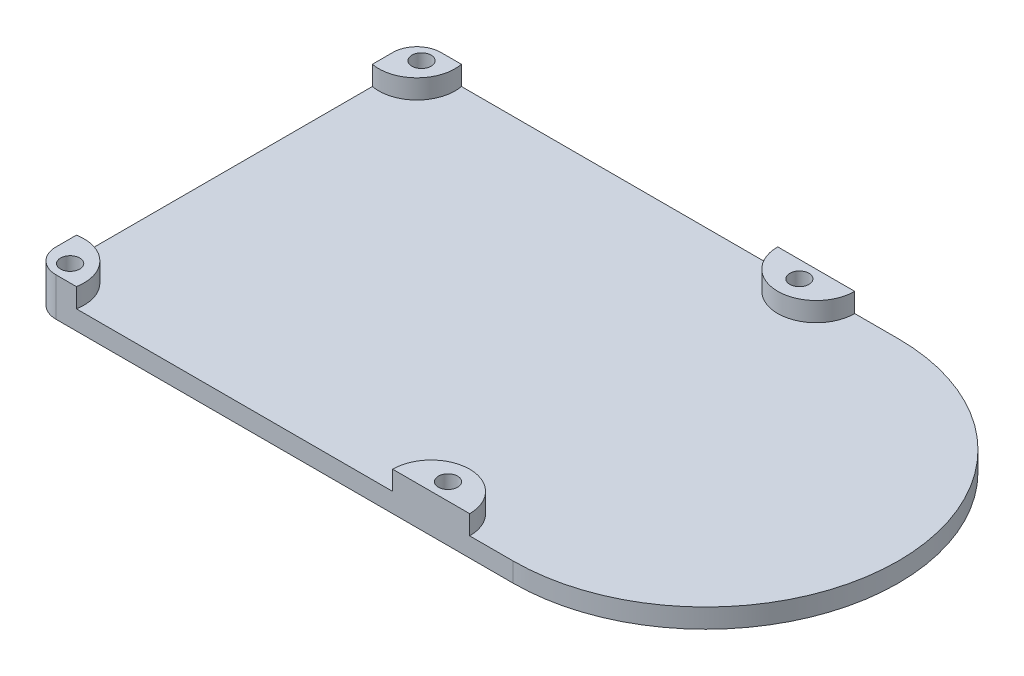
ISO-10303-21;
HEADER;
FILE_DESCRIPTION(('STEP AP214'),'2;1');
FILE_NAME('part.step','',(''),(''),'','','');
FILE_SCHEMA(('AUTOMOTIVE_DESIGN { 1 0 10303 214 1 1 1 1 }'));
ENDSEC;
DATA;
#1=APPLICATION_CONTEXT('core data for automotive mechanical design processes');
#2=APPLICATION_PROTOCOL_DEFINITION('international standard','automotive_design',2000,#1);
#3=PRODUCT_CONTEXT('',#1,'mechanical');
#4=PRODUCT('Part','Part','',(#3));
#5=PRODUCT_RELATED_PRODUCT_CATEGORY('part','',(#4));
#6=PRODUCT_DEFINITION_FORMATION('','',#4);
#7=PRODUCT_DEFINITION_CONTEXT('part definition',#1,'design');
#8=PRODUCT_DEFINITION('design','',#6,#7);
#9=PRODUCT_DEFINITION_SHAPE('','',#8);
#10=(LENGTH_UNIT() NAMED_UNIT(*) SI_UNIT(.MILLI.,.METRE.));
#11=(NAMED_UNIT(*) PLANE_ANGLE_UNIT() SI_UNIT($,.RADIAN.));
#12=(NAMED_UNIT(*) SI_UNIT($,.STERADIAN.) SOLID_ANGLE_UNIT());
#13=UNCERTAINTY_MEASURE_WITH_UNIT(LENGTH_MEASURE(1.E-05),#10,'distance_accuracy_value','');
#14=(GEOMETRIC_REPRESENTATION_CONTEXT(3) GLOBAL_UNCERTAINTY_ASSIGNED_CONTEXT((#13)) GLOBAL_UNIT_ASSIGNED_CONTEXT((#10,
#11,#12)) REPRESENTATION_CONTEXT('',''));
#15=CARTESIAN_POINT('',(0.,0.,0.));
#16=DIRECTION('',(0.,0.,1.));
#17=DIRECTION('',(1.,0.,0.));
#18=AXIS2_PLACEMENT_3D('',#15,#16,#17);
#19=CARTESIAN_POINT('',(32.96,8.,40.));
#20=DIRECTION('',(0.,-1.,0.));
#21=DIRECTION('',(0.,0.,-1.));
#22=AXIS2_PLACEMENT_3D('',#19,#20,#21);
#23=PLANE('',#22);
#24=CARTESIAN_POINT('',(32.96,8.,40.));
#25=DIRECTION('',(0.,1.,0.));
#26=DIRECTION('',(0.,0.,-1.));
#27=AXIS2_PLACEMENT_3D('',#24,#25,#26);
#28=CIRCLE('',#27,8.);
#29=CARTESIAN_POINT('',(40.96,8.,40.));
#30=VERTEX_POINT('',#29);
#31=CARTESIAN_POINT('',(24.96,8.,40.));
#32=VERTEX_POINT('',#31);
#33=EDGE_CURVE('E175',#30,#32,#28,.T.);
#34=ORIENTED_EDGE('',*,*,#33,.T.);
#35=DIRECTION('',(1.,0.,0.));
#36=VECTOR('',#35,1.);
#37=CARTESIAN_POINT('',(40.96,8.,40.));
#38=LINE('',#37,#36);
#39=EDGE_CURVE('E170',#32,#30,#38,.T.);
#40=ORIENTED_EDGE('',*,*,#39,.T.);
#41=EDGE_LOOP('',(#34,#40));
#42=FACE_BOUND('',#41,.T.);
#43=CARTESIAN_POINT('',(32.96,8.,36.5));
#44=DIRECTION('',(0.,1.,0.));
#45=DIRECTION('',(0.,0.,1.));
#46=AXIS2_PLACEMENT_3D('',#43,#44,#45);
#47=CIRCLE('',#46,2.);
#48=CARTESIAN_POINT('',(32.96,8.,38.5));
#49=VERTEX_POINT('',#48);
#50=EDGE_CURVE('E400',#49,#49,#47,.T.);
#51=ORIENTED_EDGE('',*,*,#50,.F.);
#52=EDGE_LOOP('',(#51));
#53=FACE_BOUND('',#52,.T.);
#54=ADVANCED_FACE('F16',(#42,#53),#23,.F.);
#55=CARTESIAN_POINT('',(50.,4.,0.));
#56=DIRECTION('',(0.,-1.,0.));
#57=DIRECTION('',(0.,0.,-1.));
#58=AXIS2_PLACEMENT_3D('',#55,#56,#57);
#59=PLANE('',#58);
#60=CARTESIAN_POINT('',(-48.5355339031933,4.,38.5355339031933));
#61=DIRECTION('',(0.,1.,0.));
#62=DIRECTION('',(0.,0.,1.));
#63=AXIS2_PLACEMENT_3D('',#60,#61,#62);
#64=CIRCLE('',#63,7.92893219);
#65=CARTESIAN_POINT('',(-40.74301796,4.,40.));
#66=VERTEX_POINT('',#65);
#67=CARTESIAN_POINT('',(-50.,4.,30.74301796));
#68=VERTEX_POINT('',#67);
#69=EDGE_CURVE('E134',#66,#68,#64,.T.);
#70=ORIENTED_EDGE('',*,*,#69,.F.);
#71=DIRECTION('',(1.,0.,0.));
#72=VECTOR('',#71,1.);
#73=CARTESIAN_POINT('',(50.,4.,40.));
#74=LINE('',#73,#72);
#75=CARTESIAN_POINT('',(24.96,4.,40.));
#76=VERTEX_POINT('',#75);
#77=EDGE_CURVE('E117',#66,#76,#74,.T.);
#78=ORIENTED_EDGE('',*,*,#77,.T.);
#79=CARTESIAN_POINT('',(32.96,4.,40.));
#80=DIRECTION('',(0.,1.,0.));
#81=DIRECTION('',(0.,0.,-1.));
#82=AXIS2_PLACEMENT_3D('',#79,#80,#81);
#83=CIRCLE('',#82,8.);
#84=CARTESIAN_POINT('',(40.96,4.,40.));
#85=VERTEX_POINT('',#84);
#86=EDGE_CURVE('E171',#85,#76,#83,.T.);
#87=ORIENTED_EDGE('',*,*,#86,.F.);
#88=CARTESIAN_POINT('',(50.,4.,40.));
#89=VERTEX_POINT('',#88);
#90=EDGE_CURVE('E131',#85,#89,#74,.T.);
#91=ORIENTED_EDGE('',*,*,#90,.T.);
#92=CARTESIAN_POINT('',(50.,4.,0.));
#93=DIRECTION('',(0.,1.,0.));
#94=DIRECTION('',(0.,0.,-1.));
#95=AXIS2_PLACEMENT_3D('',#92,#93,#94);
#96=CIRCLE('',#95,40.);
#97=CARTESIAN_POINT('',(50.,4.,-40.));
#98=VERTEX_POINT('',#97);
#99=EDGE_CURVE('E130',#89,#98,#96,.T.);
#100=ORIENTED_EDGE('',*,*,#99,.T.);
#101=DIRECTION('',(-1.,0.,0.));
#102=VECTOR('',#101,1.);
#103=CARTESIAN_POINT('',(50.,4.,-40.));
#104=LINE('',#103,#102);
#105=CARTESIAN_POINT('',(40.96,4.,-40.));
#106=VERTEX_POINT('',#105);
#107=EDGE_CURVE('E227',#98,#106,#104,.T.);
#108=ORIENTED_EDGE('',*,*,#107,.T.);
#109=CARTESIAN_POINT('',(32.96,4.,-40.));
#110=DIRECTION('',(0.,1.,0.));
#111=DIRECTION('',(0.,0.,1.));
#112=AXIS2_PLACEMENT_3D('',#109,#110,#111);
#113=CIRCLE('',#112,8.);
#114=CARTESIAN_POINT('',(24.96,4.,-40.));
#115=VERTEX_POINT('',#114);
#116=EDGE_CURVE('E193',#115,#106,#113,.T.);
#117=ORIENTED_EDGE('',*,*,#116,.F.);
#118=CARTESIAN_POINT('',(-40.74301796,4.,-40.));
#119=VERTEX_POINT('',#118);
#120=EDGE_CURVE('E226',#115,#119,#104,.T.);
#121=ORIENTED_EDGE('',*,*,#120,.T.);
#122=CARTESIAN_POINT('',(-48.5355339031933,4.,-38.5355339031933));
#123=DIRECTION('',(0.,1.,0.));
#124=DIRECTION('',(0.,0.,-1.));
#125=AXIS2_PLACEMENT_3D('',#122,#123,#124);
#126=CIRCLE('',#125,7.92893219);
#127=CARTESIAN_POINT('',(-50.,4.,-30.74301796));
#128=VERTEX_POINT('',#127);
#129=EDGE_CURVE('E189',#128,#119,#126,.T.);
#130=ORIENTED_EDGE('',*,*,#129,.F.);
#131=DIRECTION('',(0.,0.,1.));
#132=VECTOR('',#131,1.);
#133=CARTESIAN_POINT('',(-50.,4.,40.));
#134=LINE('',#133,#132);
#135=EDGE_CURVE('E137',#128,#68,#134,.T.);
#136=ORIENTED_EDGE('',*,*,#135,.T.);
#137=EDGE_LOOP('',(#70,#78,#87,#91,#100,#108,#117,#121,#130,#136));
#138=FACE_BOUND('',#137,.T.);
#139=ADVANCED_FACE('F135',(#138),#59,.F.);
#140=CARTESIAN_POINT('',(-50.,4.,40.));
#141=DIRECTION('',(1.,0.,0.));
#142=DIRECTION('',(0.,0.,-1.));
#143=AXIS2_PLACEMENT_3D('',#140,#141,#142);
#144=PLANE('',#143);
#145=DIRECTION('',(0.,0.,1.));
#146=VECTOR('',#145,1.);
#147=CARTESIAN_POINT('',(-50.,0.,40.));
#148=LINE('',#147,#146);
#149=CARTESIAN_POINT('',(-50.,0.,-35.));
#150=VERTEX_POINT('',#149);
#151=CARTESIAN_POINT('',(-50.,0.,35.));
#152=VERTEX_POINT('',#151);
#153=EDGE_CURVE('E220',#150,#152,#148,.T.);
#154=ORIENTED_EDGE('',*,*,#153,.T.);
#155=DIRECTION('',(0.,-1.,0.));
#156=VECTOR('',#155,1.);
#157=CARTESIAN_POINT('',(-50.,4.,35.));
#158=LINE('',#157,#156);
#159=CARTESIAN_POINT('',(-50.,8.,35.));
#160=VERTEX_POINT('',#159);
#161=EDGE_CURVE('E263',#152,#160,#158,.F.);
#162=ORIENTED_EDGE('',*,*,#161,.T.);
#163=DIRECTION('',(0.,0.,1.));
#164=VECTOR('',#163,1.);
#165=CARTESIAN_POINT('',(-50.,8.,40.));
#166=LINE('',#165,#164);
#167=CARTESIAN_POINT('',(-50.,8.,30.74301796));
#168=VERTEX_POINT('',#167);
#169=EDGE_CURVE('E153',#168,#160,#166,.T.);
#170=ORIENTED_EDGE('',*,*,#169,.F.);
#171=DIRECTION('',(0.,-1.,0.));
#172=VECTOR('',#171,1.);
#173=CARTESIAN_POINT('',(-50.,8.,30.74301796));
#174=LINE('',#173,#172);
#175=EDGE_CURVE('E148',#168,#68,#174,.T.);
#176=ORIENTED_EDGE('',*,*,#175,.T.);
#177=ORIENTED_EDGE('',*,*,#135,.F.);
#178=DIRECTION('',(0.,-1.,0.));
#179=VECTOR('',#178,1.);
#180=CARTESIAN_POINT('',(-50.,8.,-30.74301796));
#181=LINE('',#180,#179);
#182=CARTESIAN_POINT('',(-50.,8.,-30.74301796));
#183=VERTEX_POINT('',#182);
#184=EDGE_CURVE('E174',#183,#128,#181,.T.);
#185=ORIENTED_EDGE('',*,*,#184,.F.);
#186=DIRECTION('',(0.,0.,1.));
#187=VECTOR('',#186,1.);
#188=CARTESIAN_POINT('',(-50.,8.,-40.));
#189=LINE('',#188,#187);
#190=CARTESIAN_POINT('',(-50.,8.,-35.));
#191=VERTEX_POINT('',#190);
#192=EDGE_CURVE('E197',#191,#183,#189,.T.);
#193=ORIENTED_EDGE('',*,*,#192,.F.);
#194=DIRECTION('',(0.,-1.,0.));
#195=VECTOR('',#194,1.);
#196=CARTESIAN_POINT('',(-50.,4.,-35.));
#197=LINE('',#196,#195);
#198=EDGE_CURVE('E259',#191,#150,#197,.T.);
#199=ORIENTED_EDGE('',*,*,#198,.T.);
#200=EDGE_LOOP('',(#154,#162,#170,#176,#177,#185,#193,#199));
#201=FACE_BOUND('',#200,.T.);
#202=ADVANCED_FACE('F317',(#201),#144,.F.);
#203=CARTESIAN_POINT('',(50.,4.,40.));
#204=DIRECTION('',(0.,0.,-1.));
#205=DIRECTION('',(-1.,0.,0.));
#206=AXIS2_PLACEMENT_3D('',#203,#204,#205);
#207=PLANE('',#206);
#208=DIRECTION('',(1.,0.,0.));
#209=VECTOR('',#208,1.);
#210=CARTESIAN_POINT('',(-50.,8.,40.));
#211=LINE('',#210,#209);
#212=CARTESIAN_POINT('',(-45.,8.,40.));
#213=VERTEX_POINT('',#212);
#214=CARTESIAN_POINT('',(-40.74301796,8.,40.));
#215=VERTEX_POINT('',#214);
#216=EDGE_CURVE('E147',#213,#215,#211,.T.);
#217=ORIENTED_EDGE('',*,*,#216,.F.);
#218=DIRECTION('',(0.,-1.,0.));
#219=VECTOR('',#218,1.);
#220=CARTESIAN_POINT('',(-45.,4.,40.));
#221=LINE('',#220,#219);
#222=CARTESIAN_POINT('',(-45.,0.,40.));
#223=VERTEX_POINT('',#222);
#224=EDGE_CURVE('E249',#213,#223,#221,.T.);
#225=ORIENTED_EDGE('',*,*,#224,.T.);
#226=DIRECTION('',(1.,0.,0.));
#227=VECTOR('',#226,1.);
#228=CARTESIAN_POINT('',(50.,0.,40.));
#229=LINE('',#228,#227);
#230=CARTESIAN_POINT('',(50.,0.,40.));
#231=VERTEX_POINT('',#230);
#232=EDGE_CURVE('E234',#223,#231,#229,.T.);
#233=ORIENTED_EDGE('',*,*,#232,.T.);
#234=DIRECTION('',(0.,-1.,0.));
#235=VECTOR('',#234,1.);
#236=CARTESIAN_POINT('',(50.,4.,40.));
#237=LINE('',#236,#235);
#238=EDGE_CURVE('E245',#89,#231,#237,.T.);
#239=ORIENTED_EDGE('',*,*,#238,.F.);
#240=ORIENTED_EDGE('',*,*,#90,.F.);
#241=DIRECTION('',(0.,-1.,0.));
#242=VECTOR('',#241,1.);
#243=CARTESIAN_POINT('',(40.96,8.,40.));
#244=LINE('',#243,#242);
#245=EDGE_CURVE('E166',#30,#85,#244,.T.);
#246=ORIENTED_EDGE('',*,*,#245,.F.);
#247=ORIENTED_EDGE('',*,*,#39,.F.);
#248=DIRECTION('',(0.,-1.,0.));
#249=VECTOR('',#248,1.);
#250=CARTESIAN_POINT('',(24.96,8.,40.));
#251=LINE('',#250,#249);
#252=EDGE_CURVE('E125',#32,#76,#251,.T.);
#253=ORIENTED_EDGE('',*,*,#252,.T.);
#254=ORIENTED_EDGE('',*,*,#77,.F.);
#255=DIRECTION('',(0.,-1.,0.));
#256=VECTOR('',#255,1.);
#257=CARTESIAN_POINT('',(-40.74301796,8.,40.));
#258=LINE('',#257,#256);
#259=EDGE_CURVE('E122',#215,#66,#258,.T.);
#260=ORIENTED_EDGE('',*,*,#259,.F.);
#261=EDGE_LOOP('',(#217,#225,#233,#239,#240,#246,#247,#253,#254,#260));
#262=FACE_BOUND('',#261,.T.);
#263=ADVANCED_FACE('F120',(#262),#207,.F.);
#264=CARTESIAN_POINT('',(50.,4.,0.));
#265=DIRECTION('',(0.,-1.,0.));
#266=DIRECTION('',(0.,0.,-1.));
#267=AXIS2_PLACEMENT_3D('',#264,#265,#266);
#268=CYLINDRICAL_SURFACE('',#267,40.);
#269=CARTESIAN_POINT('',(50.,0.,0.));
#270=DIRECTION('',(0.,1.,0.));
#271=DIRECTION('',(0.,0.,-1.));
#272=AXIS2_PLACEMENT_3D('',#269,#270,#271);
#273=CIRCLE('',#272,40.);
#274=CARTESIAN_POINT('',(50.,0.,-40.));
#275=VERTEX_POINT('',#274);
#276=EDGE_CURVE('E237',#231,#275,#273,.T.);
#277=ORIENTED_EDGE('',*,*,#276,.T.);
#278=DIRECTION('',(0.,-1.,0.));
#279=VECTOR('',#278,1.);
#280=CARTESIAN_POINT('',(50.,4.,-40.));
#281=LINE('',#280,#279);
#282=EDGE_CURVE('E230',#98,#275,#281,.T.);
#283=ORIENTED_EDGE('',*,*,#282,.F.);
#284=ORIENTED_EDGE('',*,*,#99,.F.);
#285=ORIENTED_EDGE('',*,*,#238,.T.);
#286=EDGE_LOOP('',(#277,#283,#284,#285));
#287=FACE_BOUND('',#286,.T.);
#288=ADVANCED_FACE('F280',(#287),#268,.T.);
#289=CARTESIAN_POINT('',(50.,4.,-40.));
#290=DIRECTION('',(0.,0.,1.));
#291=DIRECTION('',(1.,0.,0.));
#292=AXIS2_PLACEMENT_3D('',#289,#290,#291);
#293=PLANE('',#292);
#294=DIRECTION('',(-1.,0.,0.));
#295=VECTOR('',#294,1.);
#296=CARTESIAN_POINT('',(50.,0.,-40.));
#297=LINE('',#296,#295);
#298=CARTESIAN_POINT('',(-45.,0.,-40.));
#299=VERTEX_POINT('',#298);
#300=EDGE_CURVE('E222',#275,#299,#297,.T.);
#301=ORIENTED_EDGE('',*,*,#300,.T.);
#302=DIRECTION('',(0.,-1.,0.));
#303=VECTOR('',#302,1.);
#304=CARTESIAN_POINT('',(-45.,4.,-40.));
#305=LINE('',#304,#303);
#306=CARTESIAN_POINT('',(-45.,8.,-40.));
#307=VERTEX_POINT('',#306);
#308=EDGE_CURVE('E25',#299,#307,#305,.F.);
#309=ORIENTED_EDGE('',*,*,#308,.T.);
#310=DIRECTION('',(-1.,0.,0.));
#311=VECTOR('',#310,1.);
#312=CARTESIAN_POINT('',(-50.,8.,-40.));
#313=LINE('',#312,#311);
#314=CARTESIAN_POINT('',(-40.74301796,8.,-40.));
#315=VERTEX_POINT('',#314);
#316=EDGE_CURVE('E194',#315,#307,#313,.T.);
#317=ORIENTED_EDGE('',*,*,#316,.F.);
#318=DIRECTION('',(0.,-1.,0.));
#319=VECTOR('',#318,1.);
#320=CARTESIAN_POINT('',(-40.74301796,8.,-40.));
#321=LINE('',#320,#319);
#322=EDGE_CURVE('E184',#315,#119,#321,.T.);
#323=ORIENTED_EDGE('',*,*,#322,.T.);
#324=ORIENTED_EDGE('',*,*,#120,.F.);
#325=DIRECTION('',(0.,-1.,0.));
#326=VECTOR('',#325,1.);
#327=CARTESIAN_POINT('',(24.96,8.,-40.));
#328=LINE('',#327,#326);
#329=CARTESIAN_POINT('',(24.96,8.,-40.));
#330=VERTEX_POINT('',#329);
#331=EDGE_CURVE('E209',#330,#115,#328,.T.);
#332=ORIENTED_EDGE('',*,*,#331,.F.);
#333=DIRECTION('',(-1.,0.,0.));
#334=VECTOR('',#333,1.);
#335=CARTESIAN_POINT('',(40.96,8.,-40.));
#336=LINE('',#335,#334);
#337=CARTESIAN_POINT('',(40.96,8.,-40.));
#338=VERTEX_POINT('',#337);
#339=EDGE_CURVE('E206',#338,#330,#336,.T.);
#340=ORIENTED_EDGE('',*,*,#339,.F.);
#341=DIRECTION('',(0.,-1.,0.));
#342=VECTOR('',#341,1.);
#343=CARTESIAN_POINT('',(40.96,8.,-40.));
#344=LINE('',#343,#342);
#345=EDGE_CURVE('E216',#338,#106,#344,.T.);
#346=ORIENTED_EDGE('',*,*,#345,.T.);
#347=ORIENTED_EDGE('',*,*,#107,.F.);
#348=ORIENTED_EDGE('',*,*,#282,.T.);
#349=EDGE_LOOP('',(#301,#309,#317,#323,#324,#332,#340,#346,#347,#348));
#350=FACE_BOUND('',#349,.T.);
#351=ADVANCED_FACE('F283',(#350),#293,.F.);
#352=CARTESIAN_POINT('',(50.,0.,0.));
#353=DIRECTION('',(0.,-1.,0.));
#354=DIRECTION('',(0.,0.,-1.));
#355=AXIS2_PLACEMENT_3D('',#352,#353,#354);
#356=PLANE('',#355);
#357=CARTESIAN_POINT('',(-45.54,0.,-36.5));
#358=DIRECTION('',(0.,1.,0.));
#359=DIRECTION('',(0.,0.,1.));
#360=AXIS2_PLACEMENT_3D('',#357,#358,#359);
#361=CIRCLE('',#360,2.);
#362=CARTESIAN_POINT('',(-45.54,0.,-34.5));
#363=VERTEX_POINT('',#362);
#364=EDGE_CURVE('E378',#363,#363,#361,.T.);
#365=ORIENTED_EDGE('',*,*,#364,.T.);
#366=EDGE_LOOP('',(#365));
#367=FACE_BOUND('',#366,.T.);
#368=CARTESIAN_POINT('',(-45.54,0.,36.5));
#369=DIRECTION('',(0.,1.,0.));
#370=DIRECTION('',(0.,0.,1.));
#371=AXIS2_PLACEMENT_3D('',#368,#369,#370);
#372=CIRCLE('',#371,2.);
#373=CARTESIAN_POINT('',(-45.54,0.,38.5));
#374=VERTEX_POINT('',#373);
#375=EDGE_CURVE('E388',#374,#374,#372,.T.);
#376=ORIENTED_EDGE('',*,*,#375,.T.);
#377=EDGE_LOOP('',(#376));
#378=FACE_BOUND('',#377,.T.);
#379=CARTESIAN_POINT('',(32.96,0.,-36.5));
#380=DIRECTION('',(0.,1.,0.));
#381=DIRECTION('',(0.,0.,1.));
#382=AXIS2_PLACEMENT_3D('',#379,#380,#381);
#383=CIRCLE('',#382,2.);
#384=CARTESIAN_POINT('',(32.96,0.,-34.5));
#385=VERTEX_POINT('',#384);
#386=EDGE_CURVE('E396',#385,#385,#383,.T.);
#387=ORIENTED_EDGE('',*,*,#386,.T.);
#388=EDGE_LOOP('',(#387));
#389=FACE_BOUND('',#388,.T.);
#390=CARTESIAN_POINT('',(32.96,0.,36.5));
#391=DIRECTION('',(0.,1.,0.));
#392=DIRECTION('',(0.,0.,1.));
#393=AXIS2_PLACEMENT_3D('',#390,#391,#392);
#394=CIRCLE('',#393,2.);
#395=CARTESIAN_POINT('',(32.96,0.,38.5));
#396=VERTEX_POINT('',#395);
#397=EDGE_CURVE('E155',#396,#396,#394,.T.);
#398=ORIENTED_EDGE('',*,*,#397,.T.);
#399=EDGE_LOOP('',(#398));
#400=FACE_BOUND('',#399,.T.);
#401=ORIENTED_EDGE('',*,*,#232,.F.);
#402=CARTESIAN_POINT('',(-45.,0.,35.));
#403=DIRECTION('',(0.,-1.,0.));
#404=DIRECTION('',(0.,0.,-1.));
#405=AXIS2_PLACEMENT_3D('',#402,#403,#404);
#406=CIRCLE('',#405,5.);
#407=EDGE_CURVE('E256',#223,#152,#406,.T.);
#408=ORIENTED_EDGE('',*,*,#407,.T.);
#409=ORIENTED_EDGE('',*,*,#153,.F.);
#410=CARTESIAN_POINT('',(-45.,0.,-35.));
#411=DIRECTION('',(0.,-1.,0.));
#412=DIRECTION('',(0.,0.,-1.));
#413=AXIS2_PLACEMENT_3D('',#410,#411,#412);
#414=CIRCLE('',#413,5.);
#415=EDGE_CURVE('E253',#150,#299,#414,.T.);
#416=ORIENTED_EDGE('',*,*,#415,.T.);
#417=ORIENTED_EDGE('',*,*,#300,.F.);
#418=ORIENTED_EDGE('',*,*,#276,.F.);
#419=EDGE_LOOP('',(#401,#408,#409,#416,#417,#418));
#420=FACE_BOUND('',#419,.T.);
#421=ADVANCED_FACE('F306',(#367,#378,#389,#400,#420),#356,.T.);
#422=CARTESIAN_POINT('',(32.96,8.,-40.));
#423=DIRECTION('',(0.,-1.,0.));
#424=DIRECTION('',(0.,0.,-1.));
#425=AXIS2_PLACEMENT_3D('',#422,#423,#424);
#426=CYLINDRICAL_SURFACE('',#425,8.);
#427=ORIENTED_EDGE('',*,*,#116,.T.);
#428=ORIENTED_EDGE('',*,*,#345,.F.);
#429=CARTESIAN_POINT('',(32.96,8.,-40.));
#430=DIRECTION('',(0.,1.,0.));
#431=DIRECTION('',(0.,0.,1.));
#432=AXIS2_PLACEMENT_3D('',#429,#430,#431);
#433=CIRCLE('',#432,8.);
#434=EDGE_CURVE('E202',#330,#338,#433,.T.);
#435=ORIENTED_EDGE('',*,*,#434,.F.);
#436=ORIENTED_EDGE('',*,*,#331,.T.);
#437=EDGE_LOOP('',(#427,#428,#435,#436));
#438=FACE_BOUND('',#437,.T.);
#439=ADVANCED_FACE('F290',(#438),#426,.T.);
#440=CARTESIAN_POINT('',(32.96,8.,-40.));
#441=DIRECTION('',(0.,1.,0.));
#442=DIRECTION('',(0.,0.,1.));
#443=AXIS2_PLACEMENT_3D('',#440,#441,#442);
#444=PLANE('',#443);
#445=CARTESIAN_POINT('',(32.96,8.,-36.5));
#446=DIRECTION('',(0.,1.,0.));
#447=DIRECTION('',(0.,0.,1.));
#448=AXIS2_PLACEMENT_3D('',#445,#446,#447);
#449=CIRCLE('',#448,2.);
#450=CARTESIAN_POINT('',(32.96,8.,-34.5));
#451=VERTEX_POINT('',#450);
#452=EDGE_CURVE('E392',#451,#451,#449,.T.);
#453=ORIENTED_EDGE('',*,*,#452,.F.);
#454=EDGE_LOOP('',(#453));
#455=FACE_BOUND('',#454,.T.);
#456=ORIENTED_EDGE('',*,*,#434,.T.);
#457=ORIENTED_EDGE('',*,*,#339,.T.);
#458=EDGE_LOOP('',(#456,#457));
#459=FACE_BOUND('',#458,.T.);
#460=ADVANCED_FACE('F292',(#455,#459),#444,.T.);
#461=CARTESIAN_POINT('',(-48.5355339031933,8.,-38.5355339031933));
#462=DIRECTION('',(0.,-1.,0.));
#463=DIRECTION('',(0.,0.,-1.));
#464=AXIS2_PLACEMENT_3D('',#461,#462,#463);
#465=CYLINDRICAL_SURFACE('',#464,7.92893219);
#466=ORIENTED_EDGE('',*,*,#129,.T.);
#467=ORIENTED_EDGE('',*,*,#322,.F.);
#468=CARTESIAN_POINT('',(-48.5355339031933,8.,-38.5355339031933));
#469=DIRECTION('',(0.,1.,0.));
#470=DIRECTION('',(0.,0.,-1.));
#471=AXIS2_PLACEMENT_3D('',#468,#469,#470);
#472=CIRCLE('',#471,7.92893219);
#473=EDGE_CURVE('E188',#183,#315,#472,.T.);
#474=ORIENTED_EDGE('',*,*,#473,.F.);
#475=ORIENTED_EDGE('',*,*,#184,.T.);
#476=EDGE_LOOP('',(#466,#467,#474,#475));
#477=FACE_BOUND('',#476,.T.);
#478=ADVANCED_FACE('F294',(#477),#465,.T.);
#479=CARTESIAN_POINT('',(-48.5355339031933,8.,-38.5355339031933));
#480=DIRECTION('',(0.,-1.,0.));
#481=DIRECTION('',(0.,0.,-1.));
#482=AXIS2_PLACEMENT_3D('',#479,#480,#481);
#483=PLANE('',#482);
#484=CARTESIAN_POINT('',(-45.54,8.,-36.5));
#485=DIRECTION('',(0.,1.,0.));
#486=DIRECTION('',(0.,0.,1.));
#487=AXIS2_PLACEMENT_3D('',#484,#485,#486);
#488=CIRCLE('',#487,2.);
#489=CARTESIAN_POINT('',(-45.54,8.,-34.5));
#490=VERTEX_POINT('',#489);
#491=EDGE_CURVE('E332',#490,#490,#488,.T.);
#492=ORIENTED_EDGE('',*,*,#491,.F.);
#493=EDGE_LOOP('',(#492));
#494=FACE_BOUND('',#493,.T.);
#495=ORIENTED_EDGE('',*,*,#316,.T.);
#496=CARTESIAN_POINT('',(-45.,8.,-35.));
#497=DIRECTION('',(0.,-1.,0.));
#498=DIRECTION('',(0.,0.,-1.));
#499=AXIS2_PLACEMENT_3D('',#496,#497,#498);
#500=CIRCLE('',#499,5.);
#501=EDGE_CURVE('E10',#307,#191,#500,.F.);
#502=ORIENTED_EDGE('',*,*,#501,.T.);
#503=ORIENTED_EDGE('',*,*,#192,.T.);
#504=ORIENTED_EDGE('',*,*,#473,.T.);
#505=EDGE_LOOP('',(#495,#502,#503,#504));
#506=FACE_BOUND('',#505,.T.);
#507=ADVANCED_FACE('F303',(#494,#506),#483,.F.);
#508=CARTESIAN_POINT('',(32.96,8.,40.));
#509=DIRECTION('',(0.,-1.,0.));
#510=DIRECTION('',(0.,0.,-1.));
#511=AXIS2_PLACEMENT_3D('',#508,#509,#510);
#512=CYLINDRICAL_SURFACE('',#511,8.);
#513=ORIENTED_EDGE('',*,*,#86,.T.);
#514=ORIENTED_EDGE('',*,*,#252,.F.);
#515=ORIENTED_EDGE('',*,*,#33,.F.);
#516=ORIENTED_EDGE('',*,*,#245,.T.);
#517=EDGE_LOOP('',(#513,#514,#515,#516));
#518=FACE_BOUND('',#517,.T.);
#519=ADVANCED_FACE('F321',(#518),#512,.T.);
#520=CARTESIAN_POINT('',(-48.5355339031933,8.,38.5355339031933));
#521=DIRECTION('',(0.,-1.,0.));
#522=DIRECTION('',(0.,0.,-1.));
#523=AXIS2_PLACEMENT_3D('',#520,#521,#522);
#524=CYLINDRICAL_SURFACE('',#523,7.92893219);
#525=ORIENTED_EDGE('',*,*,#69,.T.);
#526=ORIENTED_EDGE('',*,*,#175,.F.);
#527=CARTESIAN_POINT('',(-48.5355339031933,8.,38.5355339031933));
#528=DIRECTION('',(0.,1.,0.));
#529=DIRECTION('',(0.,0.,1.));
#530=AXIS2_PLACEMENT_3D('',#527,#528,#529);
#531=CIRCLE('',#530,7.92893219);
#532=EDGE_CURVE('E142',#215,#168,#531,.T.);
#533=ORIENTED_EDGE('',*,*,#532,.F.);
#534=ORIENTED_EDGE('',*,*,#259,.T.);
#535=EDGE_LOOP('',(#525,#526,#533,#534));
#536=FACE_BOUND('',#535,.T.);
#537=ADVANCED_FACE('F144',(#536),#524,.T.);
#538=CARTESIAN_POINT('',(-48.5355339031933,8.,38.5355339031933));
#539=DIRECTION('',(0.,1.,0.));
#540=DIRECTION('',(0.,0.,1.));
#541=AXIS2_PLACEMENT_3D('',#538,#539,#540);
#542=PLANE('',#541);
#543=CARTESIAN_POINT('',(-45.54,8.,36.5));
#544=DIRECTION('',(0.,1.,0.));
#545=DIRECTION('',(0.,0.,1.));
#546=AXIS2_PLACEMENT_3D('',#543,#544,#545);
#547=CIRCLE('',#546,2.);
#548=CARTESIAN_POINT('',(-45.54,8.,38.5));
#549=VERTEX_POINT('',#548);
#550=EDGE_CURVE('E382',#549,#549,#547,.T.);
#551=ORIENTED_EDGE('',*,*,#550,.F.);
#552=EDGE_LOOP('',(#551));
#553=FACE_BOUND('',#552,.T.);
#554=ORIENTED_EDGE('',*,*,#169,.T.);
#555=CARTESIAN_POINT('',(-45.,8.,35.));
#556=DIRECTION('',(0.,1.,0.));
#557=DIRECTION('',(0.,0.,1.));
#558=AXIS2_PLACEMENT_3D('',#555,#556,#557);
#559=CIRCLE('',#558,5.);
#560=EDGE_CURVE('E266',#160,#213,#559,.T.);
#561=ORIENTED_EDGE('',*,*,#560,.T.);
#562=ORIENTED_EDGE('',*,*,#216,.T.);
#563=ORIENTED_EDGE('',*,*,#532,.T.);
#564=EDGE_LOOP('',(#554,#561,#562,#563));
#565=FACE_BOUND('',#564,.T.);
#566=ADVANCED_FACE('F346',(#553,#565),#542,.T.);
#567=CARTESIAN_POINT('',(-45.,4.,35.));
#568=DIRECTION('',(0.,-1.,0.));
#569=DIRECTION('',(0.,0.,-1.));
#570=AXIS2_PLACEMENT_3D('',#567,#568,#569);
#571=CYLINDRICAL_SURFACE('',#570,5.);
#572=ORIENTED_EDGE('',*,*,#560,.F.);
#573=ORIENTED_EDGE('',*,*,#161,.F.);
#574=ORIENTED_EDGE('',*,*,#407,.F.);
#575=ORIENTED_EDGE('',*,*,#224,.F.);
#576=EDGE_LOOP('',(#572,#573,#574,#575));
#577=FACE_BOUND('',#576,.T.);
#578=ADVANCED_FACE('F344',(#577),#571,.T.);
#579=CARTESIAN_POINT('',(-45.,4.,-35.));
#580=DIRECTION('',(0.,-1.,0.));
#581=DIRECTION('',(0.,0.,-1.));
#582=AXIS2_PLACEMENT_3D('',#579,#580,#581);
#583=CYLINDRICAL_SURFACE('',#582,5.);
#584=ORIENTED_EDGE('',*,*,#501,.F.);
#585=ORIENTED_EDGE('',*,*,#308,.F.);
#586=ORIENTED_EDGE('',*,*,#415,.F.);
#587=ORIENTED_EDGE('',*,*,#198,.F.);
#588=EDGE_LOOP('',(#584,#585,#586,#587));
#589=FACE_BOUND('',#588,.T.);
#590=ADVANCED_FACE('F18',(#589),#583,.T.);
#591=CARTESIAN_POINT('',(32.96,8.,36.5));
#592=DIRECTION('',(0.,1.,0.));
#593=DIRECTION('',(0.,0.,1.));
#594=AXIS2_PLACEMENT_3D('',#591,#592,#593);
#595=CYLINDRICAL_SURFACE('',#594,2.);
#596=ORIENTED_EDGE('',*,*,#397,.F.);
#597=EDGE_LOOP('',(#596));
#598=FACE_BOUND('',#597,.T.);
#599=ORIENTED_EDGE('',*,*,#50,.T.);
#600=EDGE_LOOP('',(#599));
#601=FACE_BOUND('',#600,.T.);
#602=ADVANCED_FACE('F357',(#598,#601),#595,.F.);
#603=CARTESIAN_POINT('',(32.96,8.,-36.5));
#604=DIRECTION('',(0.,1.,0.));
#605=DIRECTION('',(0.,0.,1.));
#606=AXIS2_PLACEMENT_3D('',#603,#604,#605);
#607=CYLINDRICAL_SURFACE('',#606,2.);
#608=ORIENTED_EDGE('',*,*,#386,.F.);
#609=EDGE_LOOP('',(#608));
#610=FACE_BOUND('',#609,.T.);
#611=ORIENTED_EDGE('',*,*,#452,.T.);
#612=EDGE_LOOP('',(#611));
#613=FACE_BOUND('',#612,.T.);
#614=ADVANCED_FACE('F360',(#610,#613),#607,.F.);
#615=CARTESIAN_POINT('',(-45.54,8.,36.5));
#616=DIRECTION('',(0.,1.,0.));
#617=DIRECTION('',(0.,0.,1.));
#618=AXIS2_PLACEMENT_3D('',#615,#616,#617);
#619=CYLINDRICAL_SURFACE('',#618,2.);
#620=ORIENTED_EDGE('',*,*,#375,.F.);
#621=EDGE_LOOP('',(#620));
#622=FACE_BOUND('',#621,.T.);
#623=ORIENTED_EDGE('',*,*,#550,.T.);
#624=EDGE_LOOP('',(#623));
#625=FACE_BOUND('',#624,.T.);
#626=ADVANCED_FACE('F364',(#622,#625),#619,.F.);
#627=CARTESIAN_POINT('',(-45.54,8.,-36.5));
#628=DIRECTION('',(0.,1.,0.));
#629=DIRECTION('',(0.,0.,1.));
#630=AXIS2_PLACEMENT_3D('',#627,#628,#629);
#631=CYLINDRICAL_SURFACE('',#630,2.);
#632=ORIENTED_EDGE('',*,*,#364,.F.);
#633=EDGE_LOOP('',(#632));
#634=FACE_BOUND('',#633,.T.);
#635=ORIENTED_EDGE('',*,*,#491,.T.);
#636=EDGE_LOOP('',(#635));
#637=FACE_BOUND('',#636,.T.);
#638=ADVANCED_FACE('F368',(#634,#637),#631,.F.);
#639=CLOSED_SHELL('',(#54,#139,#202,#263,#288,#351,#421,#439,#460,#478,#507,#519,#537,#566,#578,
#590,#602,#614,#626,#638));
#640=MANIFOLD_SOLID_BREP('B1',#639);
#641=ADVANCED_BREP_SHAPE_REPRESENTATION('',(#18,#640),#14);
#642=SHAPE_DEFINITION_REPRESENTATION(#9,#641);
ENDSEC;
END-ISO-10303-21;
